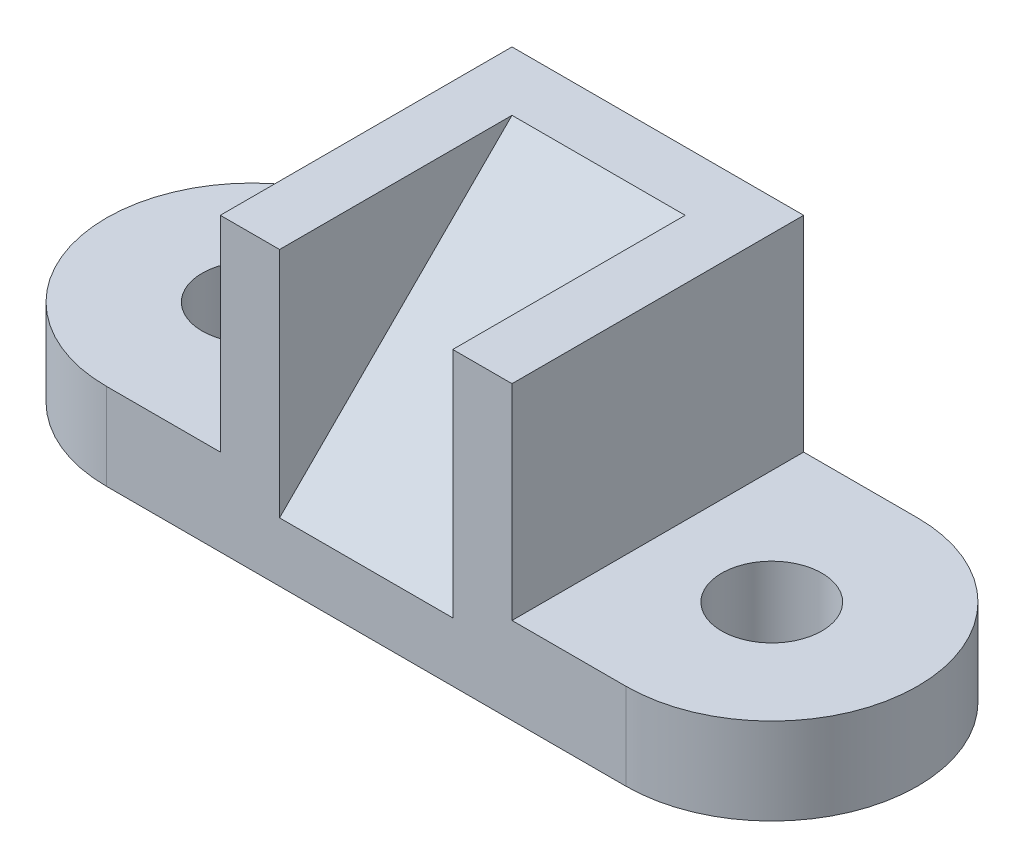
ISO-10303-21;
HEADER;
FILE_DESCRIPTION(('STEP AP214'),'2;1');
FILE_NAME('part.step','',(''),(''),'','','');
FILE_SCHEMA(('AUTOMOTIVE_DESIGN { 1 0 10303 214 1 1 1 1 }'));
ENDSEC;
DATA;
#1=APPLICATION_CONTEXT('core data for automotive mechanical design processes');
#2=APPLICATION_PROTOCOL_DEFINITION('international standard','automotive_design',2000,#1);
#3=PRODUCT_CONTEXT('',#1,'mechanical');
#4=PRODUCT('Part','Part','',(#3));
#5=PRODUCT_RELATED_PRODUCT_CATEGORY('part','',(#4));
#6=PRODUCT_DEFINITION_FORMATION('','',#4);
#7=PRODUCT_DEFINITION_CONTEXT('part definition',#1,'design');
#8=PRODUCT_DEFINITION('design','',#6,#7);
#9=PRODUCT_DEFINITION_SHAPE('','',#8);
#10=(LENGTH_UNIT() NAMED_UNIT(*) SI_UNIT(.MILLI.,.METRE.));
#11=(NAMED_UNIT(*) PLANE_ANGLE_UNIT() SI_UNIT($,.RADIAN.));
#12=(NAMED_UNIT(*) SI_UNIT($,.STERADIAN.) SOLID_ANGLE_UNIT());
#13=UNCERTAINTY_MEASURE_WITH_UNIT(LENGTH_MEASURE(1.E-05),#10,'distance_accuracy_value','');
#14=(GEOMETRIC_REPRESENTATION_CONTEXT(3) GLOBAL_UNCERTAINTY_ASSIGNED_CONTEXT((#13)) GLOBAL_UNIT_ASSIGNED_CONTEXT((#10,
#11,#12)) REPRESENTATION_CONTEXT('',''));
#15=CARTESIAN_POINT('',(0.,0.,0.));
#16=DIRECTION('',(0.,0.,1.));
#17=DIRECTION('',(1.,0.,0.));
#18=AXIS2_PLACEMENT_3D('',#15,#16,#17);
#19=CARTESIAN_POINT('',(76.,64.,0.));
#20=DIRECTION('',(-1.,0.,0.));
#21=DIRECTION('',(0.,0.,1.));
#22=AXIS2_PLACEMENT_3D('',#19,#20,#21);
#23=PLANE('',#22);
#24=DIRECTION('',(0.,0.,-1.));
#25=VECTOR('',#24,1.);
#26=CARTESIAN_POINT('',(76.,64.,0.));
#27=LINE('',#26,#25);
#28=CARTESIAN_POINT('',(76.,64.,0.));
#29=VERTEX_POINT('',#28);
#30=CARTESIAN_POINT('',(76.,64.,-51.));
#31=VERTEX_POINT('',#30);
#32=EDGE_CURVE('E139',#29,#31,#27,.T.);
#33=ORIENTED_EDGE('',*,*,#32,.T.);
#34=DIRECTION('',(0.,-0.707106781186547,0.707106781186547));
#35=VECTOR('',#34,1.);
#36=CARTESIAN_POINT('',(76.,64.,-51.));
#37=LINE('',#36,#35);
#38=CARTESIAN_POINT('',(76.,13.,0.));
#39=VERTEX_POINT('',#38);
#40=EDGE_CURVE('E138',#31,#39,#37,.T.);
#41=ORIENTED_EDGE('',*,*,#40,.T.);
#42=DIRECTION('',(0.,-1.,0.));
#43=VECTOR('',#42,1.);
#44=CARTESIAN_POINT('',(76.,64.,0.));
#45=LINE('',#44,#43);
#46=EDGE_CURVE('E124',#29,#39,#45,.T.);
#47=ORIENTED_EDGE('',*,*,#46,.F.);
#48=EDGE_LOOP('',(#33,#41,#47));
#49=FACE_BOUND('',#48,.T.);
#50=ADVANCED_FACE('F35',(#49),#23,.T.);
#51=CARTESIAN_POINT('',(38.,64.,0.));
#52=DIRECTION('',(-1.,0.,0.));
#53=DIRECTION('',(0.,0.,1.));
#54=AXIS2_PLACEMENT_3D('',#51,#52,#53);
#55=PLANE('',#54);
#56=DIRECTION('',(0.,-0.707106781186547,0.707106781186547));
#57=VECTOR('',#56,1.);
#58=CARTESIAN_POINT('',(38.,64.,-51.));
#59=LINE('',#58,#57);
#60=CARTESIAN_POINT('',(38.,64.,-51.));
#61=VERTEX_POINT('',#60);
#62=CARTESIAN_POINT('',(38.,13.,0.));
#63=VERTEX_POINT('',#62);
#64=EDGE_CURVE('E142',#61,#63,#59,.T.);
#65=ORIENTED_EDGE('',*,*,#64,.F.);
#66=DIRECTION('',(0.,0.,-1.));
#67=VECTOR('',#66,1.);
#68=CARTESIAN_POINT('',(38.,64.,0.));
#69=LINE('',#68,#67);
#70=CARTESIAN_POINT('',(38.,64.,0.));
#71=VERTEX_POINT('',#70);
#72=EDGE_CURVE('E160',#71,#61,#69,.T.);
#73=ORIENTED_EDGE('',*,*,#72,.F.);
#74=DIRECTION('',(0.,-1.,0.));
#75=VECTOR('',#74,1.);
#76=CARTESIAN_POINT('',(38.,64.,0.));
#77=LINE('',#76,#75);
#78=EDGE_CURVE('E164',#71,#63,#77,.T.);
#79=ORIENTED_EDGE('',*,*,#78,.T.);
#80=EDGE_LOOP('',(#65,#73,#79));
#81=FACE_BOUND('',#80,.T.);
#82=ADVANCED_FACE('F230',(#81),#55,.F.);
#83=CARTESIAN_POINT('',(0.,19.,0.));
#84=DIRECTION('',(0.,1.,0.));
#85=DIRECTION('',(0.,0.,1.));
#86=AXIS2_PLACEMENT_3D('',#83,#84,#85);
#87=PLANE('',#86);
#88=CARTESIAN_POINT('',(114.,19.,-32.));
#89=DIRECTION('',(0.,1.,0.));
#90=DIRECTION('',(0.,0.,1.));
#91=AXIS2_PLACEMENT_3D('',#88,#89,#90);
#92=CIRCLE('',#91,11.);
#93=CARTESIAN_POINT('',(114.,19.,-21.));
#94=VERTEX_POINT('',#93);
#95=EDGE_CURVE('E176',#94,#94,#92,.F.);
#96=ORIENTED_EDGE('',*,*,#95,.T.);
#97=EDGE_LOOP('',(#96));
#98=FACE_BOUND('',#97,.T.);
#99=DIRECTION('',(1.,0.,0.));
#100=VECTOR('',#99,1.);
#101=CARTESIAN_POINT('',(0.,19.,-64.));
#102=LINE('',#101,#100);
#103=CARTESIAN_POINT('',(89.,19.,-64.));
#104=VERTEX_POINT('',#103);
#105=CARTESIAN_POINT('',(114.,19.,-64.));
#106=VERTEX_POINT('',#105);
#107=EDGE_CURVE('E59',#104,#106,#102,.T.);
#108=ORIENTED_EDGE('',*,*,#107,.F.);
#109=DIRECTION('',(0.,0.,1.));
#110=VECTOR('',#109,1.);
#111=CARTESIAN_POINT('',(89.,19.,0.));
#112=LINE('',#111,#110);
#113=CARTESIAN_POINT('',(89.,19.,0.));
#114=VERTEX_POINT('',#113);
#115=EDGE_CURVE('E145',#104,#114,#112,.T.);
#116=ORIENTED_EDGE('',*,*,#115,.T.);
#117=DIRECTION('',(1.,0.,0.));
#118=VECTOR('',#117,1.);
#119=CARTESIAN_POINT('',(0.,19.,0.));
#120=LINE('',#119,#118);
#121=CARTESIAN_POINT('',(114.,19.,0.));
#122=VERTEX_POINT('',#121);
#123=EDGE_CURVE('E185',#114,#122,#120,.T.);
#124=ORIENTED_EDGE('',*,*,#123,.T.);
#125=CARTESIAN_POINT('',(114.,19.,-32.));
#126=DIRECTION('',(0.,1.,0.));
#127=DIRECTION('',(0.,0.,1.));
#128=AXIS2_PLACEMENT_3D('',#125,#126,#127);
#129=CIRCLE('',#128,32.);
#130=EDGE_CURVE('E189',#106,#122,#129,.F.);
#131=ORIENTED_EDGE('',*,*,#130,.F.);
#132=EDGE_LOOP('',(#108,#116,#124,#131));
#133=FACE_BOUND('',#132,.T.);
#134=ADVANCED_FACE('F224',(#98,#133),#87,.T.);
#135=CARTESIAN_POINT('',(0.,19.,-64.));
#136=DIRECTION('',(0.,0.,-1.));
#137=DIRECTION('',(-1.,0.,0.));
#138=AXIS2_PLACEMENT_3D('',#135,#136,#137);
#139=PLANE('',#138);
#140=DIRECTION('',(1.,0.,0.));
#141=VECTOR('',#140,1.);
#142=CARTESIAN_POINT('',(0.,0.,-64.));
#143=LINE('',#142,#141);
#144=CARTESIAN_POINT('',(0.,0.,-64.));
#145=VERTEX_POINT('',#144);
#146=CARTESIAN_POINT('',(114.,0.,-64.));
#147=VERTEX_POINT('',#146);
#148=EDGE_CURVE('E197',#145,#147,#143,.T.);
#149=ORIENTED_EDGE('',*,*,#148,.F.);
#150=DIRECTION('',(0.,-1.,0.));
#151=VECTOR('',#150,1.);
#152=CARTESIAN_POINT('',(0.,19.,-64.));
#153=LINE('',#152,#151);
#154=CARTESIAN_POINT('',(0.,19.,-64.));
#155=VERTEX_POINT('',#154);
#156=EDGE_CURVE('E11',#155,#145,#153,.T.);
#157=ORIENTED_EDGE('',*,*,#156,.F.);
#158=CARTESIAN_POINT('',(25.,19.,-64.));
#159=VERTEX_POINT('',#158);
#160=EDGE_CURVE('E180',#155,#159,#102,.T.);
#161=ORIENTED_EDGE('',*,*,#160,.T.);
#162=DIRECTION('',(0.,-1.,0.));
#163=VECTOR('',#162,1.);
#164=CARTESIAN_POINT('',(25.,64.,-64.));
#165=LINE('',#164,#163);
#166=CARTESIAN_POINT('',(25.,64.,-64.));
#167=VERTEX_POINT('',#166);
#168=EDGE_CURVE('E171',#167,#159,#165,.T.);
#169=ORIENTED_EDGE('',*,*,#168,.F.);
#170=DIRECTION('',(-1.,0.,0.));
#171=VECTOR('',#170,1.);
#172=CARTESIAN_POINT('',(0.,64.,-64.));
#173=LINE('',#172,#171);
#174=CARTESIAN_POINT('',(89.,64.,-64.));
#175=VERTEX_POINT('',#174);
#176=EDGE_CURVE('E156',#175,#167,#173,.T.);
#177=ORIENTED_EDGE('',*,*,#176,.F.);
#178=DIRECTION('',(0.,-1.,0.));
#179=VECTOR('',#178,1.);
#180=CARTESIAN_POINT('',(89.,64.,-64.));
#181=LINE('',#180,#179);
#182=EDGE_CURVE('E173',#175,#104,#181,.T.);
#183=ORIENTED_EDGE('',*,*,#182,.T.);
#184=ORIENTED_EDGE('',*,*,#107,.T.);
#185=DIRECTION('',(0.,-1.,0.));
#186=VECTOR('',#185,1.);
#187=CARTESIAN_POINT('',(114.,19.,-64.));
#188=LINE('',#187,#186);
#189=EDGE_CURVE('E77',#106,#147,#188,.T.);
#190=ORIENTED_EDGE('',*,*,#189,.T.);
#191=EDGE_LOOP('',(#149,#157,#161,#169,#177,#183,#184,#190));
#192=FACE_BOUND('',#191,.T.);
#193=ADVANCED_FACE('F222',(#192),#139,.T.);
#194=CARTESIAN_POINT('',(0.,19.,-32.));
#195=DIRECTION('',(0.,-1.,0.));
#196=DIRECTION('',(0.,0.,-1.));
#197=AXIS2_PLACEMENT_3D('',#194,#195,#196);
#198=CYLINDRICAL_SURFACE('',#197,32.);
#199=CARTESIAN_POINT('',(0.,0.,-32.));
#200=DIRECTION('',(0.,1.,0.));
#201=DIRECTION('',(0.,0.,1.));
#202=AXIS2_PLACEMENT_3D('',#199,#200,#201);
#203=CIRCLE('',#202,32.);
#204=CARTESIAN_POINT('',(0.,0.,0.));
#205=VERTEX_POINT('',#204);
#206=EDGE_CURVE('E199',#145,#205,#203,.T.);
#207=ORIENTED_EDGE('',*,*,#206,.T.);
#208=DIRECTION('',(0.,-1.,0.));
#209=VECTOR('',#208,1.);
#210=CARTESIAN_POINT('',(0.,19.,0.));
#211=LINE('',#210,#209);
#212=CARTESIAN_POINT('',(0.,19.,0.));
#213=VERTEX_POINT('',#212);
#214=EDGE_CURVE('E43',#213,#205,#211,.T.);
#215=ORIENTED_EDGE('',*,*,#214,.F.);
#216=CARTESIAN_POINT('',(0.,19.,-32.));
#217=DIRECTION('',(0.,1.,0.));
#218=DIRECTION('',(0.,0.,1.));
#219=AXIS2_PLACEMENT_3D('',#216,#217,#218);
#220=CIRCLE('',#219,32.);
#221=EDGE_CURVE('E182',#155,#213,#220,.T.);
#222=ORIENTED_EDGE('',*,*,#221,.F.);
#223=ORIENTED_EDGE('',*,*,#156,.T.);
#224=EDGE_LOOP('',(#207,#215,#222,#223));
#225=FACE_BOUND('',#224,.T.);
#226=ADVANCED_FACE('F217',(#225),#198,.T.);
#227=CARTESIAN_POINT('',(0.,19.,0.));
#228=DIRECTION('',(0.,0.,-1.));
#229=DIRECTION('',(-1.,0.,0.));
#230=AXIS2_PLACEMENT_3D('',#227,#228,#229);
#231=PLANE('',#230);
#232=DIRECTION('',(1.,0.,0.));
#233=VECTOR('',#232,1.);
#234=CARTESIAN_POINT('',(38.,13.,0.));
#235=LINE('',#234,#233);
#236=EDGE_CURVE('E129',#63,#39,#235,.T.);
#237=ORIENTED_EDGE('',*,*,#236,.F.);
#238=ORIENTED_EDGE('',*,*,#78,.F.);
#239=DIRECTION('',(1.,0.,0.));
#240=VECTOR('',#239,1.);
#241=CARTESIAN_POINT('',(0.,64.,0.));
#242=LINE('',#241,#240);
#243=CARTESIAN_POINT('',(25.,64.,0.));
#244=VERTEX_POINT('',#243);
#245=EDGE_CURVE('E154',#244,#71,#242,.T.);
#246=ORIENTED_EDGE('',*,*,#245,.F.);
#247=DIRECTION('',(0.,-1.,0.));
#248=VECTOR('',#247,1.);
#249=CARTESIAN_POINT('',(25.,64.,0.));
#250=LINE('',#249,#248);
#251=CARTESIAN_POINT('',(25.,19.,0.));
#252=VERTEX_POINT('',#251);
#253=EDGE_CURVE('E168',#244,#252,#250,.T.);
#254=ORIENTED_EDGE('',*,*,#253,.T.);
#255=EDGE_CURVE('E186',#213,#252,#120,.T.);
#256=ORIENTED_EDGE('',*,*,#255,.F.);
#257=ORIENTED_EDGE('',*,*,#214,.T.);
#258=DIRECTION('',(1.,0.,0.));
#259=VECTOR('',#258,1.);
#260=CARTESIAN_POINT('',(0.,0.,0.));
#261=LINE('',#260,#259);
#262=CARTESIAN_POINT('',(114.,0.,0.));
#263=VERTEX_POINT('',#262);
#264=EDGE_CURVE('E202',#205,#263,#261,.T.);
#265=ORIENTED_EDGE('',*,*,#264,.T.);
#266=DIRECTION('',(0.,-1.,0.));
#267=VECTOR('',#266,1.);
#268=CARTESIAN_POINT('',(114.,19.,0.));
#269=LINE('',#268,#267);
#270=EDGE_CURVE('E211',#122,#263,#269,.T.);
#271=ORIENTED_EDGE('',*,*,#270,.F.);
#272=ORIENTED_EDGE('',*,*,#123,.F.);
#273=DIRECTION('',(0.,-1.,0.));
#274=VECTOR('',#273,1.);
#275=CARTESIAN_POINT('',(89.,64.,0.));
#276=LINE('',#275,#274);
#277=CARTESIAN_POINT('',(89.,64.,0.));
#278=VERTEX_POINT('',#277);
#279=EDGE_CURVE('E50',#278,#114,#276,.T.);
#280=ORIENTED_EDGE('',*,*,#279,.F.);
#281=EDGE_CURVE('E131',#29,#278,#242,.T.);
#282=ORIENTED_EDGE('',*,*,#281,.F.);
#283=ORIENTED_EDGE('',*,*,#46,.T.);
#284=EDGE_LOOP('',(#237,#238,#246,#254,#256,#257,#265,#271,#272,#280,#282,#283));
#285=FACE_BOUND('',#284,.T.);
#286=ADVANCED_FACE('F126',(#285),#231,.F.);
#287=CARTESIAN_POINT('',(114.,19.,-32.));
#288=DIRECTION('',(0.,-1.,0.));
#289=DIRECTION('',(0.,0.,-1.));
#290=AXIS2_PLACEMENT_3D('',#287,#288,#289);
#291=CYLINDRICAL_SURFACE('',#290,32.);
#292=CARTESIAN_POINT('',(114.,0.,-32.));
#293=DIRECTION('',(0.,1.,0.));
#294=DIRECTION('',(0.,0.,1.));
#295=AXIS2_PLACEMENT_3D('',#292,#293,#294);
#296=CIRCLE('',#295,32.);
#297=EDGE_CURVE('E205',#147,#263,#296,.F.);
#298=ORIENTED_EDGE('',*,*,#297,.F.);
#299=ORIENTED_EDGE('',*,*,#189,.F.);
#300=ORIENTED_EDGE('',*,*,#130,.T.);
#301=ORIENTED_EDGE('',*,*,#270,.T.);
#302=EDGE_LOOP('',(#298,#299,#300,#301));
#303=FACE_BOUND('',#302,.T.);
#304=ADVANCED_FACE('F254',(#303),#291,.T.);
#305=CARTESIAN_POINT('',(114.,19.,-32.));
#306=DIRECTION('',(0.,-1.,0.));
#307=DIRECTION('',(0.,0.,-1.));
#308=AXIS2_PLACEMENT_3D('',#305,#306,#307);
#309=CYLINDRICAL_SURFACE('',#308,11.);
#310=ORIENTED_EDGE('',*,*,#95,.F.);
#311=EDGE_LOOP('',(#310));
#312=FACE_BOUND('',#311,.T.);
#313=CARTESIAN_POINT('',(114.,0.,-32.));
#314=DIRECTION('',(0.,1.,0.));
#315=DIRECTION('',(0.,0.,1.));
#316=AXIS2_PLACEMENT_3D('',#313,#314,#315);
#317=CIRCLE('',#316,11.);
#318=CARTESIAN_POINT('',(114.,0.,-21.));
#319=VERTEX_POINT('',#318);
#320=EDGE_CURVE('E135',#319,#319,#317,.F.);
#321=ORIENTED_EDGE('',*,*,#320,.T.);
#322=EDGE_LOOP('',(#321));
#323=FACE_BOUND('',#322,.T.);
#324=ADVANCED_FACE('F37',(#312,#323),#309,.F.);
#325=CARTESIAN_POINT('',(0.,19.,-32.));
#326=DIRECTION('',(0.,-1.,0.));
#327=DIRECTION('',(0.,0.,-1.));
#328=AXIS2_PLACEMENT_3D('',#325,#326,#327);
#329=CYLINDRICAL_SURFACE('',#328,11.);
#330=CARTESIAN_POINT('',(0.,19.,-32.));
#331=DIRECTION('',(0.,1.,0.));
#332=DIRECTION('',(0.,0.,1.));
#333=AXIS2_PLACEMENT_3D('',#330,#331,#332);
#334=CIRCLE('',#333,11.);
#335=CARTESIAN_POINT('',(0.,19.,-21.));
#336=VERTEX_POINT('',#335);
#337=EDGE_CURVE('E192',#336,#336,#334,.T.);
#338=ORIENTED_EDGE('',*,*,#337,.T.);
#339=EDGE_LOOP('',(#338));
#340=FACE_BOUND('',#339,.T.);
#341=CARTESIAN_POINT('',(0.,0.,-32.));
#342=DIRECTION('',(0.,1.,0.));
#343=DIRECTION('',(0.,0.,1.));
#344=AXIS2_PLACEMENT_3D('',#341,#342,#343);
#345=CIRCLE('',#344,11.);
#346=CARTESIAN_POINT('',(0.,0.,-21.));
#347=VERTEX_POINT('',#346);
#348=EDGE_CURVE('E179',#347,#347,#345,.T.);
#349=ORIENTED_EDGE('',*,*,#348,.F.);
#350=EDGE_LOOP('',(#349));
#351=FACE_BOUND('',#350,.T.);
#352=ADVANCED_FACE('F246',(#340,#351),#329,.F.);
#353=DIRECTION('',(0.,0.,1.));
#354=VECTOR('',#353,1.);
#355=CARTESIAN_POINT('',(25.,19.,0.));
#356=LINE('',#355,#354);
#357=EDGE_CURVE('E147',#159,#252,#356,.T.);
#358=ORIENTED_EDGE('',*,*,#357,.F.);
#359=ORIENTED_EDGE('',*,*,#160,.F.);
#360=ORIENTED_EDGE('',*,*,#221,.T.);
#361=ORIENTED_EDGE('',*,*,#255,.T.);
#362=EDGE_LOOP('',(#358,#359,#360,#361));
#363=FACE_BOUND('',#362,.T.);
#364=ORIENTED_EDGE('',*,*,#337,.F.);
#365=EDGE_LOOP('',(#364));
#366=FACE_BOUND('',#365,.T.);
#367=ADVANCED_FACE('F233',(#363,#366),#87,.T.);
#368=CARTESIAN_POINT('',(0.,0.,0.));
#369=DIRECTION('',(0.,1.,0.));
#370=DIRECTION('',(0.,0.,1.));
#371=AXIS2_PLACEMENT_3D('',#368,#369,#370);
#372=PLANE('',#371);
#373=ORIENTED_EDGE('',*,*,#320,.F.);
#374=EDGE_LOOP('',(#373));
#375=FACE_BOUND('',#374,.T.);
#376=ORIENTED_EDGE('',*,*,#148,.T.);
#377=ORIENTED_EDGE('',*,*,#297,.T.);
#378=ORIENTED_EDGE('',*,*,#264,.F.);
#379=ORIENTED_EDGE('',*,*,#206,.F.);
#380=EDGE_LOOP('',(#376,#377,#378,#379));
#381=FACE_BOUND('',#380,.T.);
#382=ORIENTED_EDGE('',*,*,#348,.T.);
#383=EDGE_LOOP('',(#382));
#384=FACE_BOUND('',#383,.T.);
#385=ADVANCED_FACE('F219',(#375,#381,#384),#372,.F.);
#386=CARTESIAN_POINT('',(89.,64.,0.));
#387=DIRECTION('',(1.,0.,0.));
#388=DIRECTION('',(0.,0.,-1.));
#389=AXIS2_PLACEMENT_3D('',#386,#387,#388);
#390=PLANE('',#389);
#391=ORIENTED_EDGE('',*,*,#115,.F.);
#392=ORIENTED_EDGE('',*,*,#182,.F.);
#393=DIRECTION('',(0.,0.,1.));
#394=VECTOR('',#393,1.);
#395=CARTESIAN_POINT('',(89.,64.,0.));
#396=LINE('',#395,#394);
#397=EDGE_CURVE('E153',#175,#278,#396,.T.);
#398=ORIENTED_EDGE('',*,*,#397,.T.);
#399=ORIENTED_EDGE('',*,*,#279,.T.);
#400=EDGE_LOOP('',(#391,#392,#398,#399));
#401=FACE_BOUND('',#400,.T.);
#402=ADVANCED_FACE('F242',(#401),#390,.T.);
#403=CARTESIAN_POINT('',(25.,64.,0.));
#404=DIRECTION('',(1.,0.,0.));
#405=DIRECTION('',(0.,0.,-1.));
#406=AXIS2_PLACEMENT_3D('',#403,#404,#405);
#407=PLANE('',#406);
#408=ORIENTED_EDGE('',*,*,#357,.T.);
#409=ORIENTED_EDGE('',*,*,#253,.F.);
#410=DIRECTION('',(0.,0.,1.));
#411=VECTOR('',#410,1.);
#412=CARTESIAN_POINT('',(25.,64.,0.));
#413=LINE('',#412,#411);
#414=EDGE_CURVE('E158',#167,#244,#413,.T.);
#415=ORIENTED_EDGE('',*,*,#414,.F.);
#416=ORIENTED_EDGE('',*,*,#168,.T.);
#417=EDGE_LOOP('',(#408,#409,#415,#416));
#418=FACE_BOUND('',#417,.T.);
#419=ADVANCED_FACE('F294',(#418),#407,.F.);
#420=CARTESIAN_POINT('',(0.,64.,0.));
#421=DIRECTION('',(0.,1.,0.));
#422=DIRECTION('',(0.,0.,1.));
#423=AXIS2_PLACEMENT_3D('',#420,#421,#422);
#424=PLANE('',#423);
#425=ORIENTED_EDGE('',*,*,#32,.F.);
#426=ORIENTED_EDGE('',*,*,#281,.T.);
#427=ORIENTED_EDGE('',*,*,#397,.F.);
#428=ORIENTED_EDGE('',*,*,#176,.T.);
#429=ORIENTED_EDGE('',*,*,#414,.T.);
#430=ORIENTED_EDGE('',*,*,#245,.T.);
#431=ORIENTED_EDGE('',*,*,#72,.T.);
#432=DIRECTION('',(1.,0.,0.));
#433=VECTOR('',#432,1.);
#434=CARTESIAN_POINT('',(0.,64.,-51.));
#435=LINE('',#434,#433);
#436=EDGE_CURVE('E163',#61,#31,#435,.T.);
#437=ORIENTED_EDGE('',*,*,#436,.T.);
#438=EDGE_LOOP('',(#425,#426,#427,#428,#429,#430,#431,#437));
#439=FACE_BOUND('',#438,.T.);
#440=ADVANCED_FACE('F300',(#439),#424,.T.);
#441=CARTESIAN_POINT('',(76.,64.,-51.));
#442=DIRECTION('',(0.,-0.707106781186548,-0.707106781186548));
#443=DIRECTION('',(0.,0.707106781186548,-0.707106781186548));
#444=AXIS2_PLACEMENT_3D('',#441,#442,#443);
#445=PLANE('',#444);
#446=ORIENTED_EDGE('',*,*,#64,.T.);
#447=ORIENTED_EDGE('',*,*,#236,.T.);
#448=ORIENTED_EDGE('',*,*,#40,.F.);
#449=ORIENTED_EDGE('',*,*,#436,.F.);
#450=EDGE_LOOP('',(#446,#447,#448,#449));
#451=FACE_BOUND('',#450,.T.);
#452=ADVANCED_FACE('F144',(#451),#445,.F.);
#453=CLOSED_SHELL('',(#50,#82,#134,#193,#226,#286,#304,#324,#352,#367,#385,#402,#419,#440,#452));
#454=MANIFOLD_SOLID_BREP('B2',#453);
#455=ADVANCED_BREP_SHAPE_REPRESENTATION('',(#18,#454),#14);
#456=SHAPE_DEFINITION_REPRESENTATION(#9,#455);
ENDSEC;
END-ISO-10303-21;
